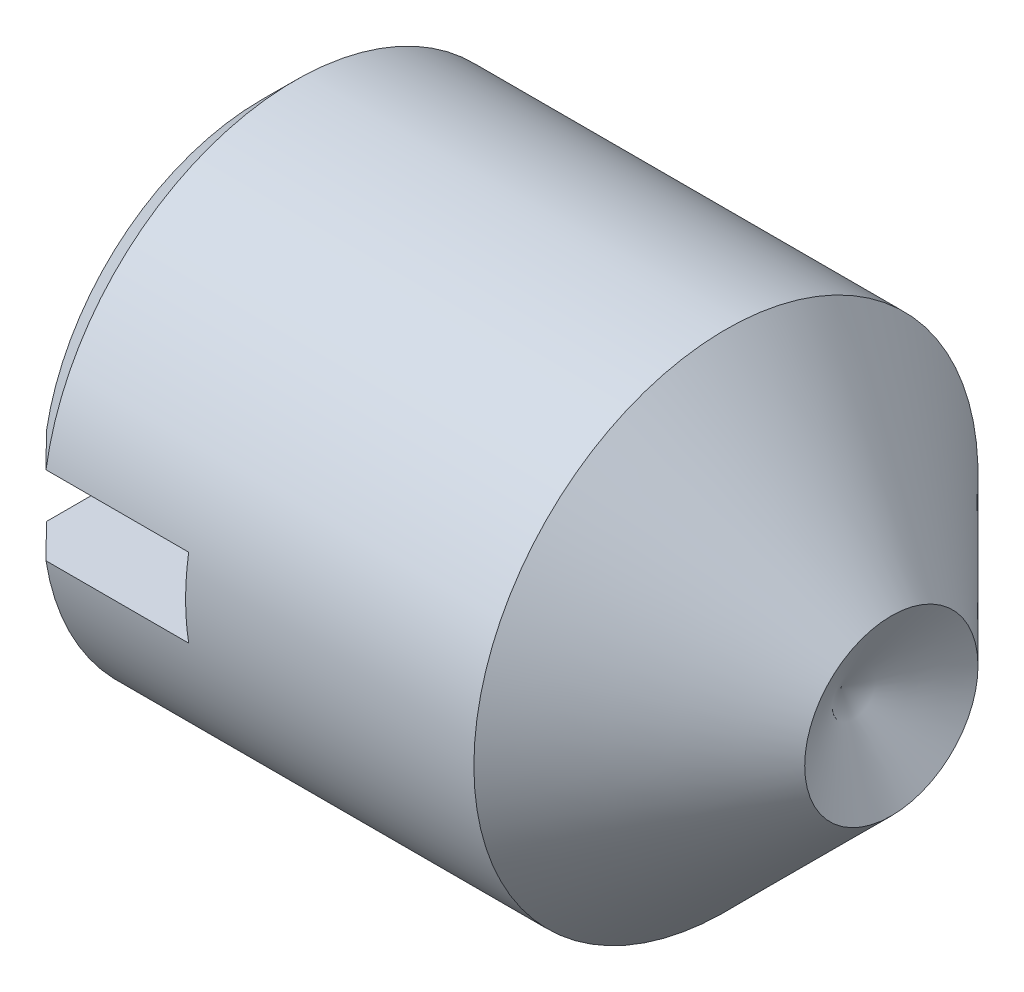
ISO-10303-21;
HEADER;
FILE_DESCRIPTION(('STEP AP214'),'2;1');
FILE_NAME('part.step','',(''),(''),'','','');
FILE_SCHEMA(('AUTOMOTIVE_DESIGN { 1 0 10303 214 1 1 1 1 }'));
ENDSEC;
DATA;
#1=APPLICATION_CONTEXT('core data for automotive mechanical design processes');
#2=APPLICATION_PROTOCOL_DEFINITION('international standard','automotive_design',2000,#1);
#3=PRODUCT_CONTEXT('',#1,'mechanical');
#4=PRODUCT('Part','Part','',(#3));
#5=PRODUCT_RELATED_PRODUCT_CATEGORY('part','',(#4));
#6=PRODUCT_DEFINITION_FORMATION('','',#4);
#7=PRODUCT_DEFINITION_CONTEXT('part definition',#1,'design');
#8=PRODUCT_DEFINITION('design','',#6,#7);
#9=PRODUCT_DEFINITION_SHAPE('','',#8);
#10=(LENGTH_UNIT() NAMED_UNIT(*) SI_UNIT(.MILLI.,.METRE.));
#11=(NAMED_UNIT(*) PLANE_ANGLE_UNIT() SI_UNIT($,.RADIAN.));
#12=(NAMED_UNIT(*) SI_UNIT($,.STERADIAN.) SOLID_ANGLE_UNIT());
#13=UNCERTAINTY_MEASURE_WITH_UNIT(LENGTH_MEASURE(1.E-05),#10,'distance_accuracy_value','');
#14=(GEOMETRIC_REPRESENTATION_CONTEXT(3) GLOBAL_UNCERTAINTY_ASSIGNED_CONTEXT((#13)) GLOBAL_UNIT_ASSIGNED_CONTEXT((#10,
#11,#12)) REPRESENTATION_CONTEXT('',''));
#15=CARTESIAN_POINT('',(0.,0.,0.));
#16=DIRECTION('',(0.,0.,1.));
#17=DIRECTION('',(1.,0.,0.));
#18=AXIS2_PLACEMENT_3D('',#15,#16,#17);
#19=CARTESIAN_POINT('',(0.,0.6928,0.));
#20=DIRECTION('',(1.,0.,0.));
#21=DIRECTION('',(0.,0.,-1.));
#22=AXIS2_PLACEMENT_3D('',#19,#20,#21);
#23=PLANE('',#22);
#24=CARTESIAN_POINT('',(0.,0.,0.));
#25=DIRECTION('',(-1.,0.,0.));
#26=DIRECTION('',(0.,0.,1.));
#27=AXIS2_PLACEMENT_3D('',#24,#25,#26);
#28=CIRCLE('',#27,0.6928);
#29=CARTESIAN_POINT('',(0.,0.125,0.681429996404619));
#30=VERTEX_POINT('',#29);
#31=CARTESIAN_POINT('',(0.,0.125,-0.681429996404619));
#32=VERTEX_POINT('',#31);
#33=EDGE_CURVE('E139',#30,#32,#28,.T.);
#34=ORIENTED_EDGE('',*,*,#33,.T.);
#35=DIRECTION('',(0.,0.,1.));
#36=VECTOR('',#35,1.);
#37=CARTESIAN_POINT('',(0.,0.125,-50.));
#38=LINE('',#37,#36);
#39=EDGE_CURVE('E182',#32,#30,#38,.T.);
#40=ORIENTED_EDGE('',*,*,#39,.T.);
#41=EDGE_LOOP('',(#34,#40));
#42=FACE_BOUND('',#41,.T.);
#43=ADVANCED_FACE('F46',(#42),#23,.F.);
#44=CARTESIAN_POINT('',(0.107200000000001,0.,0.));
#45=DIRECTION('',(1.,0.,0.));
#46=DIRECTION('',(0.,0.,-1.));
#47=AXIS2_PLACEMENT_3D('',#44,#45,#46);
#48=CONICAL_SURFACE('',#47,0.799999999999999,0.785398163397446);
#49=CARTESIAN_POINT('',(0.107200000000001,0.,0.));
#50=DIRECTION('',(-1.,0.,0.));
#51=DIRECTION('',(0.,0.,1.));
#52=AXIS2_PLACEMENT_3D('',#49,#50,#51);
#53=CIRCLE('',#52,0.799999999999999);
#54=CARTESIAN_POINT('',(0.107200000000001,0.125,0.790174031463955));
#55=VERTEX_POINT('',#54);
#56=CARTESIAN_POINT('',(0.107200000000067,0.125,-0.790174031464053));
#57=VERTEX_POINT('',#56);
#58=EDGE_CURVE('E148',#55,#57,#53,.T.);
#59=ORIENTED_EDGE('',*,*,#58,.T.);
#60=CARTESIAN_POINT('',(1.0695523072778,0.125,-1.75791372227632));
#61=CARTESIAN_POINT('',(1.00868687139621,0.125,-1.6968933690195));
#62=CARTESIAN_POINT('',(0.947828255141737,0.125,-1.63586621088327));
#63=CARTESIAN_POINT('',(0.826131849847027,0.125,-1.51378774743365));
#64=CARTESIAN_POINT('',(0.76529406143344,0.125,-1.45273644149561));
#65=CARTESIAN_POINT('',(0.643610785027135,0.125,-1.33056327949476));
#66=CARTESIAN_POINT('',(0.582765317230372,0.125,-1.26944140330909));
#67=CARTESIAN_POINT('',(0.46112435812391,0.125,-1.14715125634824));
#68=CARTESIAN_POINT('',(0.400328865504094,0.125,-1.08598298687571));
#69=CARTESIAN_POINT('',(0.279077173707687,0.125,-0.963834061068748));
#70=CARTESIAN_POINT('',(0.218620642764393,0.125,-0.90285373467582));
#71=CARTESIAN_POINT('',(0.0978430520829819,0.125,-0.780749788083067));
#72=CARTESIAN_POINT('',(0.0375220034545296,0.125,-0.719626156915844));
#73=CARTESIAN_POINT('',(-0.0828324367182872,0.125,-0.597141139436998));
#74=CARTESIAN_POINT('',(-0.142865931061162,0.125,-0.535779854894302));
#75=CARTESIAN_POINT('',(-0.232362550651617,0.125,-0.443210280455391));
#76=CARTESIAN_POINT('',(-0.262100590049646,0.125,-0.412267823526105));
#77=CARTESIAN_POINT('',(-0.321230589139754,0.125,-0.350054458057472));
#78=CARTESIAN_POINT('',(-0.35062257299804,0.125,-0.318783572745398));
#79=CARTESIAN_POINT('',(-0.387536231889864,0.125,-0.278517630753184));
#80=CARTESIAN_POINT('',(-0.395421853922767,0.125,-0.269857007630641));
#81=CARTESIAN_POINT('',(-0.411112285623964,0.125,-0.252462119858639));
#82=CARTESIAN_POINT('',(-0.418917091759068,0.125,-0.24372785201954));
#83=CARTESIAN_POINT('',(-0.442204122324852,0.125,-0.217353779378468));
#84=CARTESIAN_POINT('',(-0.457529292963459,0.125,-0.199574734866542));
#85=CARTESIAN_POINT('',(-0.485435156258195,0.125,-0.165702315756643));
#86=CARTESIAN_POINT('',(-0.498113108973286,0.125,-0.149691514001972));
#87=CARTESIAN_POINT('',(-0.516140245228016,0.125,-0.124957909643634));
#88=CARTESIAN_POINT('',(-0.521981844534989,0.125,-0.116597852033364));
#89=CARTESIAN_POINT('',(-0.53314127886941,0.125,-0.0995385996113691));
#90=CARTESIAN_POINT('',(-0.538459589053376,0.125,-0.0908397226641365));
#91=CARTESIAN_POINT('',(-0.547703389253189,0.125,-0.0739730276187898));
#92=CARTESIAN_POINT('',(-0.551718227156374,0.125,-0.0658553110985712));
#93=CARTESIAN_POINT('',(-0.55868673696797,0.125,-0.0491764662314946));
#94=CARTESIAN_POINT('',(-0.56164305417617,0.125,-0.0406165052780001));
#95=CARTESIAN_POINT('',(-0.565575487994225,0.125,-0.024679036320356));
#96=CARTESIAN_POINT('',(-0.566813763385156,0.125,-0.0173691951594687));
#97=CARTESIAN_POINT('',(-0.567985987769386,0.125,-0.00264994105792124));
#98=CARTESIAN_POINT('',(-0.567921942766585,0.125,0.0047593011800867));
#99=CARTESIAN_POINT('',(-0.56651122629752,0.125,0.0194228318710021));
#100=CARTESIAN_POINT('',(-0.565168639252381,0.125,0.0266775385736222));
#101=CARTESIAN_POINT('',(-0.561453430727986,0.125,0.040921056505494));
#102=CARTESIAN_POINT('',(-0.559078562815571,0.125,0.0479092514730781));
#103=CARTESIAN_POINT('',(-0.552401971536325,0.125,0.0645595183666162));
#104=CARTESIAN_POINT('',(-0.547711504157727,0.125,0.0740610791983355));
#105=CARTESIAN_POINT('',(-0.537440719396036,0.125,0.0925788495675402));
#106=CARTESIAN_POINT('',(-0.531858063576424,0.125,0.101593697976287));
#107=CARTESIAN_POINT('',(-0.520103793535769,0.125,0.11934613929361));
#108=CARTESIAN_POINT('',(-0.513927213669466,0.125,0.128080400418045));
#109=CARTESIAN_POINT('',(-0.501234442271682,0.125,0.145277548862611));
#110=CARTESIAN_POINT('',(-0.494718703157719,0.125,0.153740774546103));
#111=CARTESIAN_POINT('',(-0.472940368768651,0.125,0.181253048938788));
#112=CARTESIAN_POINT('',(-0.457202192110856,0.125,0.199922963815101));
#113=CARTESIAN_POINT('',(-0.425185072416053,0.125,0.236795542094897));
#114=CARTESIAN_POINT('',(-0.408905895150725,0.125,0.254997996900841));
#115=CARTESIAN_POINT('',(-0.35959012468174,0.125,0.309255236228429));
#116=CARTESIAN_POINT('',(-0.326116232585321,0.125,0.34491183254317));
#117=CARTESIAN_POINT('',(-0.258970533662518,0.125,0.41556274939393));
#118=CARTESIAN_POINT('',(-0.2253016962267,0.125,0.450559944613942));
#119=CARTESIAN_POINT('',(-0.15775918559205,0.125,0.52030805972624));
#120=CARTESIAN_POINT('',(-0.123885677901444,0.125,0.555059139236631));
#121=CARTESIAN_POINT('',(-0.042228556866587,0.125,0.638529447912845));
#122=CARTESIAN_POINT('',(0.00561621470294234,0.125,0.68718861235326));
#123=CARTESIAN_POINT('',(0.101436269454517,0.125,0.784379068202429));
#124=CARTESIAN_POINT('',(0.149411553745233,0.125,0.832910358517987));
#125=CARTESIAN_POINT('',(0.293480579026373,0.125,0.9784245831042));
#126=CARTESIAN_POINT('',(0.389686493241848,0.125,1.0752963671817));
#127=CARTESIAN_POINT('',(0.583146334287995,0.125,1.26984868368936));
#128=CARTESIAN_POINT('',(0.680401444634805,0.125,1.36752803784702));
#129=CARTESIAN_POINT('',(0.874951486085826,0.125,1.56277982174965));
#130=CARTESIAN_POINT('',(0.972246391805812,0.125,1.66035227678316));
#131=CARTESIAN_POINT('',(1.0695523072778,0.125,1.75791372227632));
#132=B_SPLINE_CURVE_WITH_KNOTS('',3,(#60,#61,#62,#63,#64,#65,#66,#67,#68,#69,#70,#71,#72,#73,
#74,#75,#76,#77,#78,#79,#80,#81,#82,#83,#84,#85,#86,#87,#88,#89,#90,#91,#92,#93,#94,#95,#96,#97,
#98,#99,#100,#101,#102,#103,#104,#105,#106,#107,#108,#109,#110,#111,#112,#113,#114,#115,#116,
#117,#118,#119,#120,#121,#122,#123,#124,#125,#126,#127,#128,#129,#130,#131),.UNSPECIFIED.,.F.,
.F.,(4,2,2,2,2,2,2,2,2,2,2,2,2,2,2,2,2,2,2,2,2,2,2,2,2,2,2,2,2,2,2,2,2,2,2,4),(0.,
0.258559013864187,0.517125222260255,0.775857664758344,1.03458309316539,1.29219167560194,
1.54982066263495,1.80734940229681,1.93609719481612,2.06483594247667,2.09997389851083,
2.13511338430992,2.20552329549667,2.2667501682839,2.29733524233775,2.3278922831839,
2.35501700755966,2.38207346473321,2.40421499341667,2.42632241941397,2.44835945727628,
2.47044469378548,2.50214547272456,2.53393074519974,2.56600973344324,2.5980469753556,
2.67127279981434,2.74453075164431,2.89123596057542,3.03692666267842,3.18251213828508,
3.38723497715884,3.59195956056372,4.00154131978651,4.41506072708177,4.82843719857983),.UNSPECIFIED.);
#133=EDGE_CURVE('E69',#57,#32,#132,.T.);
#134=ORIENTED_EDGE('',*,*,#133,.T.);
#135=ORIENTED_EDGE('',*,*,#33,.F.);
#136=EDGE_CURVE('E160',#30,#55,#132,.T.);
#137=ORIENTED_EDGE('',*,*,#136,.T.);
#138=EDGE_LOOP('',(#59,#134,#135,#137));
#139=FACE_BOUND('',#138,.T.);
#140=ADVANCED_FACE('F114',(#139),#48,.T.);
#141=CARTESIAN_POINT('',(0.,-0.125,-0.681429996404619));
#142=VERTEX_POINT('',#141);
#143=CARTESIAN_POINT('',(0.,-0.125,0.681429996404619));
#144=VERTEX_POINT('',#143);
#145=EDGE_CURVE('E135',#142,#144,#28,.T.);
#146=ORIENTED_EDGE('',*,*,#145,.T.);
#147=DIRECTION('',(0.,0.,1.));
#148=VECTOR('',#147,1.);
#149=CARTESIAN_POINT('',(0.,-0.125,-50.));
#150=LINE('',#149,#148);
#151=EDGE_CURVE('E136',#142,#144,#150,.T.);
#152=ORIENTED_EDGE('',*,*,#151,.F.);
#153=EDGE_LOOP('',(#146,#152));
#154=FACE_BOUND('',#153,.T.);
#155=ADVANCED_FACE('F48',(#154),#23,.F.);
#156=CARTESIAN_POINT('',(2.,0.,0.));
#157=DIRECTION('',(-1.,0.,0.));
#158=DIRECTION('',(0.,0.,1.));
#159=AXIS2_PLACEMENT_3D('',#156,#157,#158);
#160=CONICAL_SURFACE('',#159,0.275,0.785398163397443);
#161=CARTESIAN_POINT('',(1.47499999999999,0.,0.));
#162=DIRECTION('',(-1.,0.,0.));
#163=DIRECTION('',(0.,0.,1.));
#164=AXIS2_PLACEMENT_3D('',#161,#162,#163);
#165=CIRCLE('',#164,0.799999999999999);
#166=CARTESIAN_POINT('',(1.47499999999999,0.,0.799999999999999));
#167=VERTEX_POINT('',#166);
#168=EDGE_CURVE('E151',#167,#167,#165,.T.);
#169=ORIENTED_EDGE('',*,*,#168,.F.);
#170=EDGE_LOOP('',(#169));
#171=FACE_BOUND('',#170,.T.);
#172=CARTESIAN_POINT('',(2.,0.,0.));
#173=DIRECTION('',(-1.,0.,0.));
#174=DIRECTION('',(0.,-1.,0.));
#175=AXIS2_PLACEMENT_3D('',#172,#173,#174);
#176=CIRCLE('',#175,0.27499999999997);
#177=CARTESIAN_POINT('',(2.,-0.275,0.));
#178=VERTEX_POINT('',#177);
#179=EDGE_CURVE('E194',#178,#178,#176,.T.);
#180=ORIENTED_EDGE('',*,*,#179,.T.);
#181=EDGE_LOOP('',(#180));
#182=FACE_BOUND('',#181,.T.);
#183=ADVANCED_FACE('F125',(#171,#182),#160,.T.);
#184=CARTESIAN_POINT('',(5.24929844129929,0.,0.));
#185=DIRECTION('',(-1.,0.,0.));
#186=DIRECTION('',(0.,0.,1.));
#187=AXIS2_PLACEMENT_3D('',#184,#185,#186);
#188=CYLINDRICAL_SURFACE('',#187,0.799999999999999);
#189=ORIENTED_EDGE('',*,*,#58,.F.);
#190=DIRECTION('',(-1.,0.,0.));
#191=VECTOR('',#190,1.);
#192=CARTESIAN_POINT('',(5.24929844129929,0.125,0.790174031463955));
#193=LINE('',#192,#191);
#194=CARTESIAN_POINT('',(0.56,0.125,0.790174031463955));
#195=VERTEX_POINT('',#194);
#196=EDGE_CURVE('E144',#55,#195,#193,.F.);
#197=ORIENTED_EDGE('',*,*,#196,.T.);
#198=CARTESIAN_POINT('',(0.56,0.,0.));
#199=DIRECTION('',(1.,0.,0.));
#200=DIRECTION('',(0.,0.,-1.));
#201=AXIS2_PLACEMENT_3D('',#198,#199,#200);
#202=CIRCLE('',#201,0.799999999999999);
#203=CARTESIAN_POINT('',(0.56,-0.125,0.790174031463954));
#204=VERTEX_POINT('',#203);
#205=EDGE_CURVE('E11',#195,#204,#202,.T.);
#206=ORIENTED_EDGE('',*,*,#205,.T.);
#207=DIRECTION('',(-1.,0.,0.));
#208=VECTOR('',#207,1.);
#209=CARTESIAN_POINT('',(5.24929844129929,-0.125,0.790174031463955));
#210=LINE('',#209,#208);
#211=CARTESIAN_POINT('',(0.107200000000067,-0.125,0.790174031464053));
#212=VERTEX_POINT('',#211);
#213=EDGE_CURVE('E189',#204,#212,#210,.T.);
#214=ORIENTED_EDGE('',*,*,#213,.T.);
#215=CARTESIAN_POINT('',(0.107200000000001,-0.125,-0.790174031463955));
#216=VERTEX_POINT('',#215);
#217=EDGE_CURVE('E143',#216,#212,#53,.T.);
#218=ORIENTED_EDGE('',*,*,#217,.F.);
#219=DIRECTION('',(-1.,0.,0.));
#220=VECTOR('',#219,1.);
#221=CARTESIAN_POINT('',(5.24929844129929,-0.125,-0.790174031463955));
#222=LINE('',#221,#220);
#223=CARTESIAN_POINT('',(0.56,-0.125,-0.790174031463954));
#224=VERTEX_POINT('',#223);
#225=EDGE_CURVE('E61',#216,#224,#222,.F.);
#226=ORIENTED_EDGE('',*,*,#225,.T.);
#227=CARTESIAN_POINT('',(0.56,0.125,-0.790174031463955));
#228=VERTEX_POINT('',#227);
#229=EDGE_CURVE('E50',#224,#228,#202,.T.);
#230=ORIENTED_EDGE('',*,*,#229,.T.);
#231=DIRECTION('',(-1.,0.,0.));
#232=VECTOR('',#231,1.);
#233=CARTESIAN_POINT('',(5.24929844129929,0.125,-0.790174031463955));
#234=LINE('',#233,#232);
#235=EDGE_CURVE('E140',#228,#57,#234,.T.);
#236=ORIENTED_EDGE('',*,*,#235,.T.);
#237=EDGE_LOOP('',(#189,#197,#206,#214,#218,#226,#230,#236));
#238=FACE_BOUND('',#237,.T.);
#239=ORIENTED_EDGE('',*,*,#168,.T.);
#240=EDGE_LOOP('',(#239));
#241=FACE_BOUND('',#240,.T.);
#242=ADVANCED_FACE('F130',(#238,#241),#188,.T.);
#243=ORIENTED_EDGE('',*,*,#217,.T.);
#244=CARTESIAN_POINT('',(1.0695523072778,-0.125,1.75791372227632));
#245=CARTESIAN_POINT('',(1.00868687139621,-0.125,1.6968933690195));
#246=CARTESIAN_POINT('',(0.947828255141737,-0.125,1.63586621088327));
#247=CARTESIAN_POINT('',(0.826131849847028,-0.125,1.51378774743365));
#248=CARTESIAN_POINT('',(0.765294061433441,-0.125,1.45273644149561));
#249=CARTESIAN_POINT('',(0.643610785027137,-0.125,1.33056327949477));
#250=CARTESIAN_POINT('',(0.582765317230374,-0.125,1.26944140330909));
#251=CARTESIAN_POINT('',(0.461124358123913,-0.125,1.14715125634824));
#252=CARTESIAN_POINT('',(0.400328865504097,-0.125,1.08598298687571));
#253=CARTESIAN_POINT('',(0.27907717370769,-0.125,0.963834061068751));
#254=CARTESIAN_POINT('',(0.218620642764396,-0.125,0.902853734675823));
#255=CARTESIAN_POINT('',(0.0978430520829841,-0.125,0.780749788083069));
#256=CARTESIAN_POINT('',(0.0375220034545315,-0.125,0.719626156915846));
#257=CARTESIAN_POINT('',(-0.0828324367182858,-0.125,0.597141139436999));
#258=CARTESIAN_POINT('',(-0.142865931061161,-0.125,0.535779854894303));
#259=CARTESIAN_POINT('',(-0.232362550651616,-0.125,0.443210280455392));
#260=CARTESIAN_POINT('',(-0.262100590049645,-0.125,0.412267823526106));
#261=CARTESIAN_POINT('',(-0.321230589139754,-0.125,0.350054458057473));
#262=CARTESIAN_POINT('',(-0.35062257299804,-0.125,0.318783572745398));
#263=CARTESIAN_POINT('',(-0.387536231889864,-0.125,0.278517630753184));
#264=CARTESIAN_POINT('',(-0.395421853922767,-0.125,0.269857007630641));
#265=CARTESIAN_POINT('',(-0.411112285623964,-0.125,0.252462119858639));
#266=CARTESIAN_POINT('',(-0.418917091759068,-0.125,0.24372785201954));
#267=CARTESIAN_POINT('',(-0.442204122324852,-0.125,0.217353779378468));
#268=CARTESIAN_POINT('',(-0.457529292963459,-0.125,0.199574734866542));
#269=CARTESIAN_POINT('',(-0.485435156258195,-0.125,0.165702315756643));
#270=CARTESIAN_POINT('',(-0.498113108973286,-0.125,0.149691514001972));
#271=CARTESIAN_POINT('',(-0.516140245228016,-0.125,0.124957909643634));
#272=CARTESIAN_POINT('',(-0.521981844534988,-0.125,0.116597852033365));
#273=CARTESIAN_POINT('',(-0.53314127886941,-0.125,0.0995385996113696));
#274=CARTESIAN_POINT('',(-0.538459589053376,-0.125,0.0908397226641369));
#275=CARTESIAN_POINT('',(-0.547703389253189,-0.125,0.07397302761879));
#276=CARTESIAN_POINT('',(-0.551718227156373,-0.125,0.0658553110985715));
#277=CARTESIAN_POINT('',(-0.558686736967969,-0.125,0.0491764662314949));
#278=CARTESIAN_POINT('',(-0.56164305417617,-0.125,0.0406165052780005));
#279=CARTESIAN_POINT('',(-0.565575487994225,-0.125,0.0246790363203564));
#280=CARTESIAN_POINT('',(-0.566813763385156,-0.125,0.0173691951594691));
#281=CARTESIAN_POINT('',(-0.567985987769386,-0.125,0.00264994105792162));
#282=CARTESIAN_POINT('',(-0.567921942766585,-0.125,-0.00475930118008632));
#283=CARTESIAN_POINT('',(-0.56651122629752,-0.125,-0.0194228318710017));
#284=CARTESIAN_POINT('',(-0.565168639252381,-0.125,-0.0266775385736218));
#285=CARTESIAN_POINT('',(-0.561453430727986,-0.125,-0.0409210565054936));
#286=CARTESIAN_POINT('',(-0.559078562815571,-0.125,-0.0479092514730777));
#287=CARTESIAN_POINT('',(-0.552401971536326,-0.125,-0.0645595183666157));
#288=CARTESIAN_POINT('',(-0.547711504157727,-0.125,-0.0740610791983349));
#289=CARTESIAN_POINT('',(-0.537440719396037,-0.125,-0.0925788495675393));
#290=CARTESIAN_POINT('',(-0.531858063576425,-0.125,-0.101593697976287));
#291=CARTESIAN_POINT('',(-0.520103793535769,-0.125,-0.11934613929361));
#292=CARTESIAN_POINT('',(-0.513927213669467,-0.125,-0.128080400418044));
#293=CARTESIAN_POINT('',(-0.501234442271683,-0.125,-0.14527754886261));
#294=CARTESIAN_POINT('',(-0.49471870315772,-0.125,-0.153740774546102));
#295=CARTESIAN_POINT('',(-0.472940368768652,-0.125,-0.181253048938786));
#296=CARTESIAN_POINT('',(-0.457202192110857,-0.125,-0.199922963815099));
#297=CARTESIAN_POINT('',(-0.425185072416055,-0.125,-0.236795542094895));
#298=CARTESIAN_POINT('',(-0.408905895150727,-0.125,-0.254997996900839));
#299=CARTESIAN_POINT('',(-0.359590124681742,-0.125,-0.309255236228426));
#300=CARTESIAN_POINT('',(-0.326116232585324,-0.125,-0.344911832543167));
#301=CARTESIAN_POINT('',(-0.258970533662522,-0.125,-0.415562749393926));
#302=CARTESIAN_POINT('',(-0.225301696226704,-0.125,-0.450559944613938));
#303=CARTESIAN_POINT('',(-0.157759185592054,-0.125,-0.520308059726235));
#304=CARTESIAN_POINT('',(-0.123885677901449,-0.125,-0.555059139236626));
#305=CARTESIAN_POINT('',(-0.0422285568665922,-0.125,-0.63852944791284));
#306=CARTESIAN_POINT('',(0.00561621470293736,-0.125,-0.687188612353256));
#307=CARTESIAN_POINT('',(0.101436269454512,-0.125,-0.784379068202424));
#308=CARTESIAN_POINT('',(0.149411553745229,-0.125,-0.832910358517983));
#309=CARTESIAN_POINT('',(0.29348057902637,-0.125,-0.978424583104197));
#310=CARTESIAN_POINT('',(0.389686493241845,-0.125,-1.0752963671817));
#311=CARTESIAN_POINT('',(0.583146334287993,-0.125,-1.26984868368935));
#312=CARTESIAN_POINT('',(0.680401444634804,-0.125,-1.36752803784702));
#313=CARTESIAN_POINT('',(0.874951486085825,-0.125,-1.56277982174965));
#314=CARTESIAN_POINT('',(0.972246391805812,-0.125,-1.66035227678316));
#315=CARTESIAN_POINT('',(1.0695523072778,-0.125,-1.75791372227632));
#316=B_SPLINE_CURVE_WITH_KNOTS('',3,(#244,#245,#246,#247,#248,#249,#250,#251,#252,#253,#254,
#255,#256,#257,#258,#259,#260,#261,#262,#263,#264,#265,#266,#267,#268,#269,#270,#271,#272,#273,
#274,#275,#276,#277,#278,#279,#280,#281,#282,#283,#284,#285,#286,#287,#288,#289,#290,#291,#292,
#293,#294,#295,#296,#297,#298,#299,#300,#301,#302,#303,#304,#305,#306,#307,#308,#309,#310,#311,
#312,#313,#314,#315),.UNSPECIFIED.,.F.,.F.,(4,2,2,2,2,2,2,2,2,2,2,2,2,2,2,2,2,2,2,2,2,2,2,2,2,2,
2,2,2,2,2,2,2,2,2,4),(0.,0.258559013864186,0.517125222260254,0.775857664758341,1.03458309316539,
1.29219167560193,1.54982066263495,1.80734940229681,1.93609719481612,2.06483594247667,
2.09997389851083,2.13511338430993,2.20552329549667,2.2667501682839,2.29733524233775,
2.3278922831839,2.35501700755966,2.38207346473321,2.40421499341667,2.42632241941397,
2.44835945727628,2.47044469378548,2.50214547272456,2.53393074519974,2.56600973344324,
2.5980469753556,2.67127279981434,2.74453075164431,2.89123596057542,3.03692666267842,
3.18251213828508,3.38723497715884,3.59195956056372,4.0015413197865,4.41506072708177,
4.82843719857983),.UNSPECIFIED.);
#317=EDGE_CURVE('E159',#212,#144,#316,.T.);
#318=ORIENTED_EDGE('',*,*,#317,.T.);
#319=ORIENTED_EDGE('',*,*,#145,.F.);
#320=EDGE_CURVE('E154',#142,#216,#316,.T.);
#321=ORIENTED_EDGE('',*,*,#320,.T.);
#322=EDGE_LOOP('',(#243,#318,#319,#321));
#323=FACE_BOUND('',#322,.T.);
#324=ADVANCED_FACE('F122',(#323),#48,.T.);
#325=CARTESIAN_POINT('',(0.56,-0.125,-50.));
#326=DIRECTION('',(1.,0.,0.));
#327=DIRECTION('',(0.,0.,-1.));
#328=AXIS2_PLACEMENT_3D('',#325,#326,#327);
#329=PLANE('',#328);
#330=DIRECTION('',(0.,0.,1.));
#331=VECTOR('',#330,1.);
#332=CARTESIAN_POINT('',(0.56,0.125,-50.));
#333=LINE('',#332,#331);
#334=EDGE_CURVE('E178',#228,#195,#333,.T.);
#335=ORIENTED_EDGE('',*,*,#334,.F.);
#336=ORIENTED_EDGE('',*,*,#229,.F.);
#337=DIRECTION('',(0.,0.,1.));
#338=VECTOR('',#337,1.);
#339=CARTESIAN_POINT('',(0.56,-0.125,-50.));
#340=LINE('',#339,#338);
#341=EDGE_CURVE('E183',#224,#204,#340,.T.);
#342=ORIENTED_EDGE('',*,*,#341,.T.);
#343=ORIENTED_EDGE('',*,*,#205,.F.);
#344=EDGE_LOOP('',(#335,#336,#342,#343));
#345=FACE_BOUND('',#344,.T.);
#346=ADVANCED_FACE('F169',(#345),#329,.F.);
#347=CARTESIAN_POINT('',(0.,0.125,-50.));
#348=DIRECTION('',(0.,1.,0.));
#349=DIRECTION('',(0.,0.,1.));
#350=AXIS2_PLACEMENT_3D('',#347,#348,#349);
#351=PLANE('',#350);
#352=ORIENTED_EDGE('',*,*,#334,.T.);
#353=ORIENTED_EDGE('',*,*,#196,.F.);
#354=ORIENTED_EDGE('',*,*,#136,.F.);
#355=ORIENTED_EDGE('',*,*,#39,.F.);
#356=ORIENTED_EDGE('',*,*,#133,.F.);
#357=ORIENTED_EDGE('',*,*,#235,.F.);
#358=EDGE_LOOP('',(#352,#353,#354,#355,#356,#357));
#359=FACE_BOUND('',#358,.T.);
#360=ADVANCED_FACE('F109',(#359),#351,.F.);
#361=CARTESIAN_POINT('',(0.,-0.125,-50.));
#362=DIRECTION('',(0.,-1.,0.));
#363=DIRECTION('',(0.,0.,-1.));
#364=AXIS2_PLACEMENT_3D('',#361,#362,#363);
#365=PLANE('',#364);
#366=ORIENTED_EDGE('',*,*,#341,.F.);
#367=ORIENTED_EDGE('',*,*,#225,.F.);
#368=ORIENTED_EDGE('',*,*,#320,.F.);
#369=ORIENTED_EDGE('',*,*,#151,.T.);
#370=ORIENTED_EDGE('',*,*,#317,.F.);
#371=ORIENTED_EDGE('',*,*,#213,.F.);
#372=EDGE_LOOP('',(#366,#367,#368,#369,#370,#371));
#373=FACE_BOUND('',#372,.T.);
#374=ADVANCED_FACE('F103',(#373),#365,.F.);
#375=CARTESIAN_POINT('',(1.84122867597285,0.,0.));
#376=DIRECTION('',(1.,0.,0.));
#377=DIRECTION('',(0.,1.,0.));
#378=AXIS2_PLACEMENT_3D('',#375,#376,#377);
#379=CONICAL_SURFACE('',#378,0.,1.0471975511965);
#380=ORIENTED_EDGE('',*,*,#179,.F.);
#381=EDGE_LOOP('',(#380));
#382=FACE_BOUND('',#381,.T.);
#383=CARTESIAN_POINT('',(1.84122867597285,0.,0.));
#384=VERTEX_POINT('',#383);
#385=VERTEX_LOOP('',#384);
#386=FACE_BOUND('',#385,.T.);
#387=ADVANCED_FACE('F101',(#382,#386),#379,.F.);
#388=CLOSED_SHELL('',(#43,#140,#155,#183,#242,#324,#346,#360,#374,#387));
#389=MANIFOLD_SOLID_BREP('B2',#388);
#390=ADVANCED_BREP_SHAPE_REPRESENTATION('',(#18,#389),#14);
#391=SHAPE_DEFINITION_REPRESENTATION(#9,#390);
ENDSEC;
END-ISO-10303-21;
